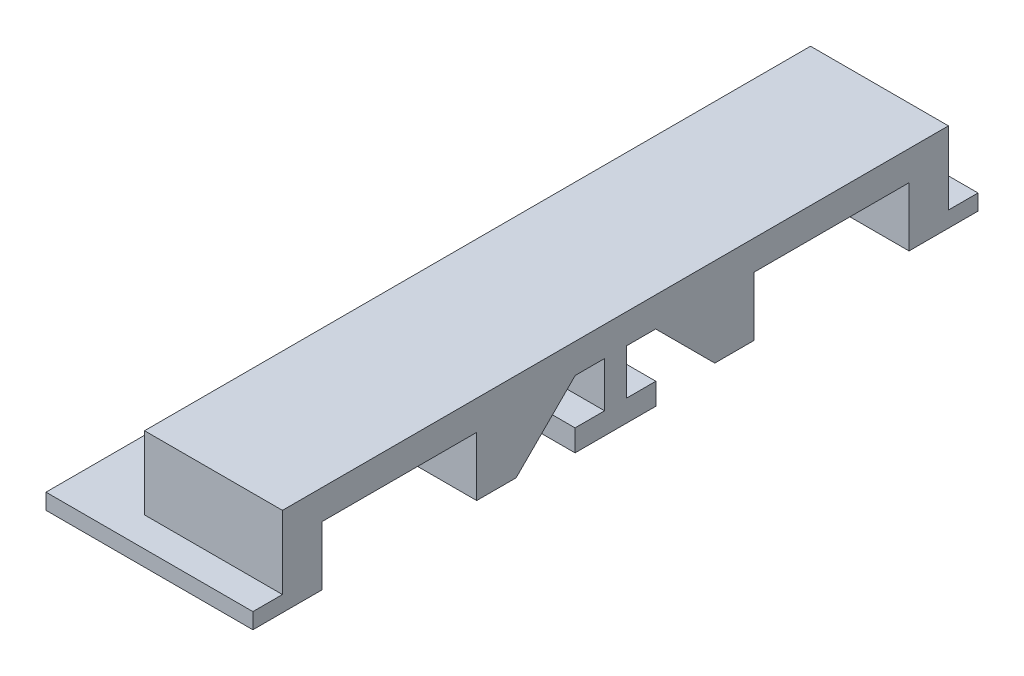
ISO-10303-21;
HEADER;
FILE_DESCRIPTION(('STEP AP214'),'2;1');
FILE_NAME('part.step','',(''),(''),'','','');
FILE_SCHEMA(('AUTOMOTIVE_DESIGN { 1 0 10303 214 1 1 1 1 }'));
ENDSEC;
DATA;
#1=APPLICATION_CONTEXT('core data for automotive mechanical design processes');
#2=APPLICATION_PROTOCOL_DEFINITION('international standard','automotive_design',2000,#1);
#3=PRODUCT_CONTEXT('',#1,'mechanical');
#4=PRODUCT('Part','Part','',(#3));
#5=PRODUCT_RELATED_PRODUCT_CATEGORY('part','',(#4));
#6=PRODUCT_DEFINITION_FORMATION('','',#4);
#7=PRODUCT_DEFINITION_CONTEXT('part definition',#1,'design');
#8=PRODUCT_DEFINITION('design','',#6,#7);
#9=PRODUCT_DEFINITION_SHAPE('','',#8);
#10=(LENGTH_UNIT() NAMED_UNIT(*) SI_UNIT(.MILLI.,.METRE.));
#11=(NAMED_UNIT(*) PLANE_ANGLE_UNIT() SI_UNIT($,.RADIAN.));
#12=(NAMED_UNIT(*) SI_UNIT($,.STERADIAN.) SOLID_ANGLE_UNIT());
#13=UNCERTAINTY_MEASURE_WITH_UNIT(LENGTH_MEASURE(1.E-05),#10,'distance_accuracy_value','');
#14=(GEOMETRIC_REPRESENTATION_CONTEXT(3) GLOBAL_UNCERTAINTY_ASSIGNED_CONTEXT((#13)) GLOBAL_UNIT_ASSIGNED_CONTEXT((#10,
#11,#12)) REPRESENTATION_CONTEXT('',''));
#15=CARTESIAN_POINT('',(0.,0.,0.));
#16=DIRECTION('',(0.,0.,1.));
#17=DIRECTION('',(1.,0.,0.));
#18=AXIS2_PLACEMENT_3D('',#15,#16,#17);
#19=CARTESIAN_POINT('',(0.,0.,0.));
#20=DIRECTION('',(1.,0.,0.));
#21=DIRECTION('',(0.,0.,-1.));
#22=AXIS2_PLACEMENT_3D('',#19,#20,#21);
#23=PLANE('',#22);
#24=DIRECTION('',(0.,0.,-1.));
#25=VECTOR('',#24,1.);
#26=CARTESIAN_POINT('',(0.,2.4,0.));
#27=LINE('',#26,#25);
#28=CARTESIAN_POINT('',(0.,2.4,16.9));
#29=VERTEX_POINT('',#28);
#30=CARTESIAN_POINT('',(0.,2.4,14.9));
#31=VERTEX_POINT('',#30);
#32=EDGE_CURVE('E305',#29,#31,#27,.T.);
#33=ORIENTED_EDGE('',*,*,#32,.F.);
#34=DIRECTION('',(0.,1.,0.));
#35=VECTOR('',#34,1.);
#36=CARTESIAN_POINT('',(0.,0.,16.9));
#37=LINE('',#36,#35);
#38=CARTESIAN_POINT('',(0.,6.1,16.9));
#39=VERTEX_POINT('',#38);
#40=EDGE_CURVE('E413',#29,#39,#37,.T.);
#41=ORIENTED_EDGE('',*,*,#40,.T.);
#42=DIRECTION('',(0.,0.,-1.));
#43=VECTOR('',#42,1.);
#44=CARTESIAN_POINT('',(0.,6.1,0.));
#45=LINE('',#44,#43);
#46=CARTESIAN_POINT('',(0.,6.1,-16.9));
#47=VERTEX_POINT('',#46);
#48=EDGE_CURVE('E338',#39,#47,#45,.T.);
#49=ORIENTED_EDGE('',*,*,#48,.T.);
#50=DIRECTION('',(0.,1.,0.));
#51=VECTOR('',#50,1.);
#52=CARTESIAN_POINT('',(0.,0.,-16.9));
#53=LINE('',#52,#51);
#54=CARTESIAN_POINT('',(0.,2.4,-16.9));
#55=VERTEX_POINT('',#54);
#56=EDGE_CURVE('E343',#55,#47,#53,.T.);
#57=ORIENTED_EDGE('',*,*,#56,.F.);
#58=DIRECTION('',(0.,0.,-1.));
#59=VECTOR('',#58,1.);
#60=CARTESIAN_POINT('',(0.,2.4,0.));
#61=LINE('',#60,#59);
#62=CARTESIAN_POINT('',(0.,2.4,-14.9));
#63=VERTEX_POINT('',#62);
#64=EDGE_CURVE('E41',#63,#55,#61,.T.);
#65=ORIENTED_EDGE('',*,*,#64,.F.);
#66=DIRECTION('',(0.,-1.,0.));
#67=VECTOR('',#66,1.);
#68=CARTESIAN_POINT('',(0.,0.,-14.9));
#69=LINE('',#68,#67);
#70=CARTESIAN_POINT('',(0.,4.6,-14.9));
#71=VERTEX_POINT('',#70);
#72=EDGE_CURVE('E456',#71,#63,#69,.T.);
#73=ORIENTED_EDGE('',*,*,#72,.F.);
#74=DIRECTION('',(0.,0.,1.));
#75=VECTOR('',#74,1.);
#76=CARTESIAN_POINT('',(0.,4.6,0.));
#77=LINE('',#76,#75);
#78=CARTESIAN_POINT('',(0.,4.6,-7.04142135623731));
#79=VERTEX_POINT('',#78);
#80=EDGE_CURVE('E453',#71,#79,#77,.T.);
#81=ORIENTED_EDGE('',*,*,#80,.T.);
#82=DIRECTION('',(0.,-1.,0.));
#83=VECTOR('',#82,1.);
#84=CARTESIAN_POINT('',(0.,0.,-7.04142135623731));
#85=LINE('',#84,#83);
#86=CARTESIAN_POINT('',(0.,2.4,-7.04142135623731));
#87=VERTEX_POINT('',#86);
#88=EDGE_CURVE('E450',#79,#87,#85,.T.);
#89=ORIENTED_EDGE('',*,*,#88,.T.);
#90=CARTESIAN_POINT('',(0.,2.4,-4.24142135623732));
#91=VERTEX_POINT('',#90);
#92=EDGE_CURVE('E11',#91,#87,#61,.T.);
#93=ORIENTED_EDGE('',*,*,#92,.F.);
#94=DIRECTION('',(0.,0.707106781186551,0.707106781186544));
#95=VECTOR('',#94,1.);
#96=CARTESIAN_POINT('',(0.,3.32071067811865,-3.32071067811868));
#97=LINE('',#96,#95);
#98=CARTESIAN_POINT('',(0.,4.6,-2.04142135623735));
#99=VERTEX_POINT('',#98);
#100=EDGE_CURVE('E448',#91,#99,#97,.T.);
#101=ORIENTED_EDGE('',*,*,#100,.T.);
#102=DIRECTION('',(0.,0.,1.));
#103=VECTOR('',#102,1.);
#104=CARTESIAN_POINT('',(0.,4.6,0.));
#105=LINE('',#104,#103);
#106=CARTESIAN_POINT('',(0.,4.6,-0.550000000000034));
#107=VERTEX_POINT('',#106);
#108=EDGE_CURVE('E445',#99,#107,#105,.T.);
#109=ORIENTED_EDGE('',*,*,#108,.T.);
#110=DIRECTION('',(0.,1.,0.));
#111=VECTOR('',#110,1.);
#112=CARTESIAN_POINT('',(0.,0.,-0.550000000000038));
#113=LINE('',#112,#111);
#114=CARTESIAN_POINT('',(0.,2.3,-0.550000000000036));
#115=VERTEX_POINT('',#114);
#116=EDGE_CURVE('E442',#115,#107,#113,.T.);
#117=ORIENTED_EDGE('',*,*,#116,.F.);
#118=DIRECTION('',(0.,0.,1.));
#119=VECTOR('',#118,1.);
#120=CARTESIAN_POINT('',(0.,2.3,0.));
#121=LINE('',#120,#119);
#122=CARTESIAN_POINT('',(0.,2.3,-2.05000000000004));
#123=VERTEX_POINT('',#122);
#124=EDGE_CURVE('E440',#123,#115,#121,.T.);
#125=ORIENTED_EDGE('',*,*,#124,.F.);
#126=DIRECTION('',(0.,1.,0.));
#127=VECTOR('',#126,1.);
#128=CARTESIAN_POINT('',(0.,0.,-2.05000000000004));
#129=LINE('',#128,#127);
#130=CARTESIAN_POINT('',(0.,1.2,-2.05000000000004));
#131=VERTEX_POINT('',#130);
#132=EDGE_CURVE('E438',#131,#123,#129,.T.);
#133=ORIENTED_EDGE('',*,*,#132,.F.);
#134=DIRECTION('',(0.,0.,-1.));
#135=VECTOR('',#134,1.);
#136=CARTESIAN_POINT('',(0.,1.2,0.));
#137=LINE('',#136,#135);
#138=CARTESIAN_POINT('',(0.,1.2,2.05000000000004));
#139=VERTEX_POINT('',#138);
#140=EDGE_CURVE('E436',#139,#131,#137,.T.);
#141=ORIENTED_EDGE('',*,*,#140,.F.);
#142=DIRECTION('',(0.,-1.,0.));
#143=VECTOR('',#142,1.);
#144=CARTESIAN_POINT('',(0.,0.,2.05000000000004));
#145=LINE('',#144,#143);
#146=CARTESIAN_POINT('',(0.,2.3,2.05000000000004));
#147=VERTEX_POINT('',#146);
#148=EDGE_CURVE('E434',#147,#139,#145,.T.);
#149=ORIENTED_EDGE('',*,*,#148,.F.);
#150=DIRECTION('',(0.,0.,1.));
#151=VECTOR('',#150,1.);
#152=CARTESIAN_POINT('',(0.,2.3,0.));
#153=LINE('',#152,#151);
#154=CARTESIAN_POINT('',(0.,2.3,0.550000000000036));
#155=VERTEX_POINT('',#154);
#156=EDGE_CURVE('E432',#155,#147,#153,.T.);
#157=ORIENTED_EDGE('',*,*,#156,.F.);
#158=DIRECTION('',(0.,1.,0.));
#159=VECTOR('',#158,1.);
#160=CARTESIAN_POINT('',(0.,0.,0.550000000000029));
#161=LINE('',#160,#159);
#162=CARTESIAN_POINT('',(0.,4.6,0.550000000000034));
#163=VERTEX_POINT('',#162);
#164=EDGE_CURVE('E429',#155,#163,#161,.T.);
#165=ORIENTED_EDGE('',*,*,#164,.T.);
#166=DIRECTION('',(0.,0.,1.));
#167=VECTOR('',#166,1.);
#168=CARTESIAN_POINT('',(0.,4.6,0.));
#169=LINE('',#168,#167);
#170=CARTESIAN_POINT('',(0.,4.6,2.04142135623734));
#171=VERTEX_POINT('',#170);
#172=EDGE_CURVE('E426',#163,#171,#169,.T.);
#173=ORIENTED_EDGE('',*,*,#172,.T.);
#174=DIRECTION('',(0.,-0.707106781186551,0.707106781186544));
#175=VECTOR('',#174,1.);
#176=CARTESIAN_POINT('',(0.,3.32071067811865,3.32071067811868));
#177=LINE('',#176,#175);
#178=CARTESIAN_POINT('',(0.,2.4,4.24142135623732));
#179=VERTEX_POINT('',#178);
#180=EDGE_CURVE('E423',#171,#179,#177,.T.);
#181=ORIENTED_EDGE('',*,*,#180,.T.);
#182=CARTESIAN_POINT('',(0.,2.4,7.04142135623731));
#183=VERTEX_POINT('',#182);
#184=EDGE_CURVE('E303',#183,#179,#27,.T.);
#185=ORIENTED_EDGE('',*,*,#184,.F.);
#186=DIRECTION('',(0.,-1.,0.));
#187=VECTOR('',#186,1.);
#188=CARTESIAN_POINT('',(0.,0.,7.04142135623731));
#189=LINE('',#188,#187);
#190=CARTESIAN_POINT('',(0.,4.6,7.04142135623731));
#191=VERTEX_POINT('',#190);
#192=EDGE_CURVE('E420',#191,#183,#189,.T.);
#193=ORIENTED_EDGE('',*,*,#192,.F.);
#194=DIRECTION('',(0.,0.,-1.));
#195=VECTOR('',#194,1.);
#196=CARTESIAN_POINT('',(0.,4.6,0.));
#197=LINE('',#196,#195);
#198=CARTESIAN_POINT('',(0.,4.6,14.9));
#199=VERTEX_POINT('',#198);
#200=EDGE_CURVE('E418',#199,#191,#197,.T.);
#201=ORIENTED_EDGE('',*,*,#200,.F.);
#202=DIRECTION('',(0.,-1.,0.));
#203=VECTOR('',#202,1.);
#204=CARTESIAN_POINT('',(0.,0.,14.9));
#205=LINE('',#204,#203);
#206=EDGE_CURVE('E416',#199,#31,#205,.T.);
#207=ORIENTED_EDGE('',*,*,#206,.T.);
#208=EDGE_LOOP('',(#33,#41,#49,#57,#65,#73,#81,#89,#93,#101,#109,#117,#125,#133,#141,#149,#157,
#165,#173,#181,#185,#193,#201,#207));
#209=FACE_BOUND('',#208,.T.);
#210=ADVANCED_FACE('F37',(#209),#23,.F.);
#211=CARTESIAN_POINT('',(7.,0.,14.9));
#212=DIRECTION('',(0.,0.,-1.));
#213=DIRECTION('',(-1.,0.,0.));
#214=AXIS2_PLACEMENT_3D('',#211,#212,#213);
#215=PLANE('',#214);
#216=DIRECTION('',(0.,-1.,0.));
#217=VECTOR('',#216,1.);
#218=CARTESIAN_POINT('',(3.5,0.,14.9));
#219=LINE('',#218,#217);
#220=CARTESIAN_POINT('',(3.5,2.4,14.9));
#221=VERTEX_POINT('',#220);
#222=CARTESIAN_POINT('',(3.5,1.6,14.9));
#223=VERTEX_POINT('',#222);
#224=EDGE_CURVE('E52',#221,#223,#219,.T.);
#225=ORIENTED_EDGE('',*,*,#224,.F.);
#226=DIRECTION('',(-1.,0.,0.));
#227=VECTOR('',#226,1.);
#228=CARTESIAN_POINT('',(7.,2.4,14.9));
#229=LINE('',#228,#227);
#230=EDGE_CURVE('E56',#221,#31,#229,.T.);
#231=ORIENTED_EDGE('',*,*,#230,.T.);
#232=ORIENTED_EDGE('',*,*,#206,.F.);
#233=DIRECTION('',(-1.,0.,0.));
#234=VECTOR('',#233,1.);
#235=CARTESIAN_POINT('',(7.,4.6,14.9));
#236=LINE('',#235,#234);
#237=CARTESIAN_POINT('',(7.,4.6,14.9));
#238=VERTEX_POINT('',#237);
#239=EDGE_CURVE('E509',#238,#199,#236,.T.);
#240=ORIENTED_EDGE('',*,*,#239,.F.);
#241=DIRECTION('',(0.,-1.,0.));
#242=VECTOR('',#241,1.);
#243=CARTESIAN_POINT('',(7.,0.,14.9));
#244=LINE('',#243,#242);
#245=CARTESIAN_POINT('',(7.,1.6,14.9));
#246=VERTEX_POINT('',#245);
#247=EDGE_CURVE('E354',#238,#246,#244,.T.);
#248=ORIENTED_EDGE('',*,*,#247,.T.);
#249=DIRECTION('',(-1.,0.,0.));
#250=VECTOR('',#249,1.);
#251=CARTESIAN_POINT('',(7.,1.6,14.9));
#252=LINE('',#251,#250);
#253=EDGE_CURVE('E511',#246,#223,#252,.T.);
#254=ORIENTED_EDGE('',*,*,#253,.T.);
#255=EDGE_LOOP('',(#225,#231,#232,#240,#248,#254));
#256=FACE_BOUND('',#255,.T.);
#257=ADVANCED_FACE('F603',(#256),#215,.T.);
#258=CARTESIAN_POINT('',(7.,0.,7.04142135623731));
#259=DIRECTION('',(0.,0.,-1.));
#260=DIRECTION('',(-1.,0.,0.));
#261=AXIS2_PLACEMENT_3D('',#258,#259,#260);
#262=PLANE('',#261);
#263=DIRECTION('',(-1.,0.,0.));
#264=VECTOR('',#263,1.);
#265=CARTESIAN_POINT('',(7.,2.4,7.04142135623731));
#266=LINE('',#265,#264);
#267=CARTESIAN_POINT('',(3.5,2.4,7.04142135623731));
#268=VERTEX_POINT('',#267);
#269=EDGE_CURVE('E301',#268,#183,#266,.T.);
#270=ORIENTED_EDGE('',*,*,#269,.F.);
#271=DIRECTION('',(0.,-1.,0.));
#272=VECTOR('',#271,1.);
#273=CARTESIAN_POINT('',(3.5,0.,7.04142135623731));
#274=LINE('',#273,#272);
#275=CARTESIAN_POINT('',(3.5,1.6,7.04142135623731));
#276=VERTEX_POINT('',#275);
#277=EDGE_CURVE('E297',#268,#276,#274,.T.);
#278=ORIENTED_EDGE('',*,*,#277,.T.);
#279=DIRECTION('',(-1.,0.,0.));
#280=VECTOR('',#279,1.);
#281=CARTESIAN_POINT('',(7.,1.6,7.04142135623731));
#282=LINE('',#281,#280);
#283=CARTESIAN_POINT('',(7.,1.6,7.04142135623731));
#284=VERTEX_POINT('',#283);
#285=EDGE_CURVE('E268',#284,#276,#282,.T.);
#286=ORIENTED_EDGE('',*,*,#285,.F.);
#287=DIRECTION('',(0.,-1.,0.));
#288=VECTOR('',#287,1.);
#289=CARTESIAN_POINT('',(7.,0.,7.04142135623731));
#290=LINE('',#289,#288);
#291=CARTESIAN_POINT('',(7.,4.6,7.04142135623731));
#292=VERTEX_POINT('',#291);
#293=EDGE_CURVE('E359',#292,#284,#290,.T.);
#294=ORIENTED_EDGE('',*,*,#293,.F.);
#295=DIRECTION('',(-1.,0.,0.));
#296=VECTOR('',#295,1.);
#297=CARTESIAN_POINT('',(7.,4.6,7.04142135623731));
#298=LINE('',#297,#296);
#299=EDGE_CURVE('E506',#292,#191,#298,.T.);
#300=ORIENTED_EDGE('',*,*,#299,.T.);
#301=ORIENTED_EDGE('',*,*,#192,.T.);
#302=EDGE_LOOP('',(#270,#278,#286,#294,#300,#301));
#303=FACE_BOUND('',#302,.T.);
#304=ADVANCED_FACE('F596',(#303),#262,.F.);
#305=CARTESIAN_POINT('',(7.,0.,-7.04142135623731));
#306=DIRECTION('',(0.,0.,-1.));
#307=DIRECTION('',(-1.,0.,0.));
#308=AXIS2_PLACEMENT_3D('',#305,#306,#307);
#309=PLANE('',#308);
#310=DIRECTION('',(0.,-1.,0.));
#311=VECTOR('',#310,1.);
#312=CARTESIAN_POINT('',(3.5,0.,-7.04142135623731));
#313=LINE('',#312,#311);
#314=CARTESIAN_POINT('',(3.5,2.4,-7.04142135623731));
#315=VERTEX_POINT('',#314);
#316=CARTESIAN_POINT('',(3.5,1.6,-7.04142135623731));
#317=VERTEX_POINT('',#316);
#318=EDGE_CURVE('E335',#315,#317,#313,.T.);
#319=ORIENTED_EDGE('',*,*,#318,.F.);
#320=DIRECTION('',(-1.,0.,0.));
#321=VECTOR('',#320,1.);
#322=CARTESIAN_POINT('',(7.,2.4,-7.04142135623731));
#323=LINE('',#322,#321);
#324=EDGE_CURVE('E331',#315,#87,#323,.T.);
#325=ORIENTED_EDGE('',*,*,#324,.T.);
#326=ORIENTED_EDGE('',*,*,#88,.F.);
#327=DIRECTION('',(-1.,0.,0.));
#328=VECTOR('',#327,1.);
#329=CARTESIAN_POINT('',(7.,4.6,-7.04142135623731));
#330=LINE('',#329,#328);
#331=CARTESIAN_POINT('',(7.,4.6,-7.04142135623731));
#332=VERTEX_POINT('',#331);
#333=EDGE_CURVE('E473',#332,#79,#330,.T.);
#334=ORIENTED_EDGE('',*,*,#333,.F.);
#335=DIRECTION('',(0.,-1.,0.));
#336=VECTOR('',#335,1.);
#337=CARTESIAN_POINT('',(7.,0.,-7.04142135623731));
#338=LINE('',#337,#336);
#339=CARTESIAN_POINT('',(7.,1.6,-7.04142135623731));
#340=VERTEX_POINT('',#339);
#341=EDGE_CURVE('E391',#332,#340,#338,.T.);
#342=ORIENTED_EDGE('',*,*,#341,.T.);
#343=DIRECTION('',(-1.,0.,0.));
#344=VECTOR('',#343,1.);
#345=CARTESIAN_POINT('',(7.,1.6,-7.04142135623731));
#346=LINE('',#345,#344);
#347=EDGE_CURVE('E475',#340,#317,#346,.T.);
#348=ORIENTED_EDGE('',*,*,#347,.T.);
#349=EDGE_LOOP('',(#319,#325,#326,#334,#342,#348));
#350=FACE_BOUND('',#349,.T.);
#351=ADVANCED_FACE('F651',(#350),#309,.T.);
#352=CARTESIAN_POINT('',(7.,0.,-14.9));
#353=DIRECTION('',(0.,0.,-1.));
#354=DIRECTION('',(-1.,0.,0.));
#355=AXIS2_PLACEMENT_3D('',#352,#353,#354);
#356=PLANE('',#355);
#357=DIRECTION('',(-1.,0.,0.));
#358=VECTOR('',#357,1.);
#359=CARTESIAN_POINT('',(7.,2.40000000000001,-14.9));
#360=LINE('',#359,#358);
#361=CARTESIAN_POINT('',(3.5,2.4,-14.9));
#362=VERTEX_POINT('',#361);
#363=EDGE_CURVE('E328',#362,#63,#360,.T.);
#364=ORIENTED_EDGE('',*,*,#363,.F.);
#365=DIRECTION('',(0.,-1.,0.));
#366=VECTOR('',#365,1.);
#367=CARTESIAN_POINT('',(3.5,0.,-14.9));
#368=LINE('',#367,#366);
#369=CARTESIAN_POINT('',(3.5,1.6,-14.9));
#370=VERTEX_POINT('',#369);
#371=EDGE_CURVE('E333',#362,#370,#368,.T.);
#372=ORIENTED_EDGE('',*,*,#371,.T.);
#373=DIRECTION('',(-1.,0.,0.));
#374=VECTOR('',#373,1.);
#375=CARTESIAN_POINT('',(7.,1.6,-14.9));
#376=LINE('',#375,#374);
#377=CARTESIAN_POINT('',(7.,1.6,-14.9));
#378=VERTEX_POINT('',#377);
#379=EDGE_CURVE('E468',#378,#370,#376,.T.);
#380=ORIENTED_EDGE('',*,*,#379,.F.);
#381=DIRECTION('',(0.,-1.,0.));
#382=VECTOR('',#381,1.);
#383=CARTESIAN_POINT('',(7.,0.,-14.9));
#384=LINE('',#383,#382);
#385=CARTESIAN_POINT('',(7.,4.6,-14.9));
#386=VERTEX_POINT('',#385);
#387=EDGE_CURVE('E397',#386,#378,#384,.T.);
#388=ORIENTED_EDGE('',*,*,#387,.F.);
#389=DIRECTION('',(-1.,0.,0.));
#390=VECTOR('',#389,1.);
#391=CARTESIAN_POINT('',(7.,4.6,-14.9));
#392=LINE('',#391,#390);
#393=EDGE_CURVE('E471',#386,#71,#392,.T.);
#394=ORIENTED_EDGE('',*,*,#393,.T.);
#395=ORIENTED_EDGE('',*,*,#72,.T.);
#396=EDGE_LOOP('',(#364,#372,#380,#388,#394,#395));
#397=FACE_BOUND('',#396,.T.);
#398=ADVANCED_FACE('F531',(#397),#356,.F.);
#399=CARTESIAN_POINT('',(7.,6.1,0.));
#400=DIRECTION('',(0.,1.,0.));
#401=DIRECTION('',(0.,0.,1.));
#402=AXIS2_PLACEMENT_3D('',#399,#400,#401);
#403=PLANE('',#402);
#404=ORIENTED_EDGE('',*,*,#48,.F.);
#405=DIRECTION('',(-1.,0.,0.));
#406=VECTOR('',#405,1.);
#407=CARTESIAN_POINT('',(7.,6.1,16.9));
#408=LINE('',#407,#406);
#409=CARTESIAN_POINT('',(7.,6.1,16.9));
#410=VERTEX_POINT('',#409);
#411=EDGE_CURVE('E517',#410,#39,#408,.T.);
#412=ORIENTED_EDGE('',*,*,#411,.F.);
#413=DIRECTION('',(0.,0.,-1.));
#414=VECTOR('',#413,1.);
#415=CARTESIAN_POINT('',(7.,6.1,0.));
#416=LINE('',#415,#414);
#417=CARTESIAN_POINT('',(7.,6.1,-16.9));
#418=VERTEX_POINT('',#417);
#419=EDGE_CURVE('E339',#410,#418,#416,.T.);
#420=ORIENTED_EDGE('',*,*,#419,.T.);
#421=DIRECTION('',(-1.,0.,0.));
#422=VECTOR('',#421,1.);
#423=CARTESIAN_POINT('',(7.,6.1,-16.9));
#424=LINE('',#423,#422);
#425=EDGE_CURVE('E410',#418,#47,#424,.T.);
#426=ORIENTED_EDGE('',*,*,#425,.T.);
#427=EDGE_LOOP('',(#404,#412,#420,#426));
#428=FACE_BOUND('',#427,.T.);
#429=ADVANCED_FACE('F39',(#428),#403,.T.);
#430=CARTESIAN_POINT('',(7.,0.,16.9));
#431=DIRECTION('',(0.,0.,1.));
#432=DIRECTION('',(1.,0.,0.));
#433=AXIS2_PLACEMENT_3D('',#430,#431,#432);
#434=PLANE('',#433);
#435=ORIENTED_EDGE('',*,*,#40,.F.);
#436=DIRECTION('',(-1.,0.,0.));
#437=VECTOR('',#436,1.);
#438=CARTESIAN_POINT('',(7.,2.4,16.9));
#439=LINE('',#438,#437);
#440=CARTESIAN_POINT('',(7.,2.4,16.9));
#441=VERTEX_POINT('',#440);
#442=EDGE_CURVE('E516',#441,#29,#439,.T.);
#443=ORIENTED_EDGE('',*,*,#442,.F.);
#444=DIRECTION('',(0.,1.,0.));
#445=VECTOR('',#444,1.);
#446=CARTESIAN_POINT('',(7.,0.,16.9));
#447=LINE('',#446,#445);
#448=EDGE_CURVE('E342',#441,#410,#447,.T.);
#449=ORIENTED_EDGE('',*,*,#448,.T.);
#450=ORIENTED_EDGE('',*,*,#411,.T.);
#451=EDGE_LOOP('',(#435,#443,#449,#450));
#452=FACE_BOUND('',#451,.T.);
#453=ADVANCED_FACE('F690',(#452),#434,.T.);
#454=CARTESIAN_POINT('',(7.,2.4,0.));
#455=DIRECTION('',(0.,1.,0.));
#456=DIRECTION('',(0.,0.,1.));
#457=AXIS2_PLACEMENT_3D('',#454,#455,#456);
#458=PLANE('',#457);
#459=ORIENTED_EDGE('',*,*,#442,.T.);
#460=ORIENTED_EDGE('',*,*,#32,.T.);
#461=ORIENTED_EDGE('',*,*,#230,.F.);
#462=DIRECTION('',(0.,0.,-1.));
#463=VECTOR('',#462,1.);
#464=CARTESIAN_POINT('',(3.5,2.4,0.));
#465=LINE('',#464,#463);
#466=EDGE_CURVE('E284',#221,#268,#465,.T.);
#467=ORIENTED_EDGE('',*,*,#466,.T.);
#468=ORIENTED_EDGE('',*,*,#269,.T.);
#469=ORIENTED_EDGE('',*,*,#184,.T.);
#470=DIRECTION('',(1.,0.,0.));
#471=VECTOR('',#470,1.);
#472=CARTESIAN_POINT('',(-3.5,2.4,4.24142135623732));
#473=LINE('',#472,#471);
#474=CARTESIAN_POINT('',(-3.5,2.4,4.24142135623732));
#475=VERTEX_POINT('',#474);
#476=EDGE_CURVE('E293',#475,#179,#473,.T.);
#477=ORIENTED_EDGE('',*,*,#476,.F.);
#478=DIRECTION('',(0.,0.,-1.));
#479=VECTOR('',#478,1.);
#480=CARTESIAN_POINT('',(-3.5,2.4,0.));
#481=LINE('',#480,#479);
#482=CARTESIAN_POINT('',(-3.5,2.4,18.4));
#483=VERTEX_POINT('',#482);
#484=EDGE_CURVE('E277',#483,#475,#481,.T.);
#485=ORIENTED_EDGE('',*,*,#484,.F.);
#486=DIRECTION('',(-1.,0.,0.));
#487=VECTOR('',#486,1.);
#488=CARTESIAN_POINT('',(7.,2.4,18.4));
#489=LINE('',#488,#487);
#490=CARTESIAN_POINT('',(7.,2.4,18.4));
#491=VERTEX_POINT('',#490);
#492=EDGE_CURVE('E514',#491,#483,#489,.T.);
#493=ORIENTED_EDGE('',*,*,#492,.F.);
#494=DIRECTION('',(0.,0.,-1.));
#495=VECTOR('',#494,1.);
#496=CARTESIAN_POINT('',(7.,2.4,0.));
#497=LINE('',#496,#495);
#498=EDGE_CURVE('E346',#491,#441,#497,.T.);
#499=ORIENTED_EDGE('',*,*,#498,.T.);
#500=EDGE_LOOP('',(#459,#460,#461,#467,#468,#469,#477,#485,#493,#499));
#501=FACE_BOUND('',#500,.T.);
#502=ADVANCED_FACE('F592',(#501),#458,.T.);
#503=CARTESIAN_POINT('',(7.,0.,18.4));
#504=DIRECTION('',(0.,0.,1.));
#505=DIRECTION('',(1.,0.,0.));
#506=AXIS2_PLACEMENT_3D('',#503,#504,#505);
#507=PLANE('',#506);
#508=ORIENTED_EDGE('',*,*,#492,.T.);
#509=DIRECTION('',(0.,1.,0.));
#510=VECTOR('',#509,1.);
#511=CARTESIAN_POINT('',(-3.5,0.,18.4));
#512=LINE('',#511,#510);
#513=CARTESIAN_POINT('',(-3.5,1.6,18.4));
#514=VERTEX_POINT('',#513);
#515=EDGE_CURVE('E291',#514,#483,#512,.T.);
#516=ORIENTED_EDGE('',*,*,#515,.F.);
#517=DIRECTION('',(-1.,0.,0.));
#518=VECTOR('',#517,1.);
#519=CARTESIAN_POINT('',(7.,1.6,18.4));
#520=LINE('',#519,#518);
#521=CARTESIAN_POINT('',(7.,1.6,18.4));
#522=VERTEX_POINT('',#521);
#523=EDGE_CURVE('E282',#522,#514,#520,.T.);
#524=ORIENTED_EDGE('',*,*,#523,.F.);
#525=DIRECTION('',(0.,1.,0.));
#526=VECTOR('',#525,1.);
#527=CARTESIAN_POINT('',(7.,0.,18.4));
#528=LINE('',#527,#526);
#529=EDGE_CURVE('E349',#522,#491,#528,.T.);
#530=ORIENTED_EDGE('',*,*,#529,.T.);
#531=EDGE_LOOP('',(#508,#516,#524,#530));
#532=FACE_BOUND('',#531,.T.);
#533=ADVANCED_FACE('F684',(#532),#507,.T.);
#534=CARTESIAN_POINT('',(7.,4.6,0.));
#535=DIRECTION('',(0.,1.,0.));
#536=DIRECTION('',(0.,0.,1.));
#537=AXIS2_PLACEMENT_3D('',#534,#535,#536);
#538=PLANE('',#537);
#539=ORIENTED_EDGE('',*,*,#200,.T.);
#540=ORIENTED_EDGE('',*,*,#299,.F.);
#541=DIRECTION('',(0.,0.,-1.));
#542=VECTOR('',#541,1.);
#543=CARTESIAN_POINT('',(7.,4.6,0.));
#544=LINE('',#543,#542);
#545=EDGE_CURVE('E357',#238,#292,#544,.T.);
#546=ORIENTED_EDGE('',*,*,#545,.F.);
#547=ORIENTED_EDGE('',*,*,#239,.T.);
#548=EDGE_LOOP('',(#539,#540,#546,#547));
#549=FACE_BOUND('',#548,.T.);
#550=ADVANCED_FACE('F606',(#549),#538,.F.);
#551=CARTESIAN_POINT('',(7.,1.6,0.));
#552=DIRECTION('',(0.,-1.,0.));
#553=DIRECTION('',(0.,0.,-1.));
#554=AXIS2_PLACEMENT_3D('',#551,#552,#553);
#555=PLANE('',#554);
#556=ORIENTED_EDGE('',*,*,#523,.T.);
#557=DIRECTION('',(0.,0.,1.));
#558=VECTOR('',#557,1.);
#559=CARTESIAN_POINT('',(-3.5,1.6,0.));
#560=LINE('',#559,#558);
#561=CARTESIAN_POINT('',(-3.5,1.6,5.04142135623731));
#562=VERTEX_POINT('',#561);
#563=EDGE_CURVE('E275',#562,#514,#560,.T.);
#564=ORIENTED_EDGE('',*,*,#563,.F.);
#565=DIRECTION('',(-1.,0.,0.));
#566=VECTOR('',#565,1.);
#567=CARTESIAN_POINT('',(7.,1.6,5.04142135623731));
#568=LINE('',#567,#566);
#569=CARTESIAN_POINT('',(7.,1.6,5.04142135623731));
#570=VERTEX_POINT('',#569);
#571=EDGE_CURVE('E257',#570,#562,#568,.T.);
#572=ORIENTED_EDGE('',*,*,#571,.F.);
#573=DIRECTION('',(0.,0.,1.));
#574=VECTOR('',#573,1.);
#575=CARTESIAN_POINT('',(7.,1.6,0.));
#576=LINE('',#575,#574);
#577=EDGE_CURVE('E361',#570,#284,#576,.T.);
#578=ORIENTED_EDGE('',*,*,#577,.T.);
#579=ORIENTED_EDGE('',*,*,#285,.T.);
#580=DIRECTION('',(0.,0.,1.));
#581=VECTOR('',#580,1.);
#582=CARTESIAN_POINT('',(3.5,1.6,0.));
#583=LINE('',#582,#581);
#584=EDGE_CURVE('E287',#276,#223,#583,.T.);
#585=ORIENTED_EDGE('',*,*,#584,.T.);
#586=ORIENTED_EDGE('',*,*,#253,.F.);
#587=DIRECTION('',(0.,0.,1.));
#588=VECTOR('',#587,1.);
#589=CARTESIAN_POINT('',(7.,1.6,0.));
#590=LINE('',#589,#588);
#591=EDGE_CURVE('E352',#246,#522,#590,.T.);
#592=ORIENTED_EDGE('',*,*,#591,.T.);
#593=EDGE_LOOP('',(#556,#564,#572,#578,#579,#585,#586,#592));
#594=FACE_BOUND('',#593,.T.);
#595=ADVANCED_FACE('F280',(#594),#555,.T.);
#596=CARTESIAN_POINT('',(7.,3.32071067811865,3.32071067811868));
#597=DIRECTION('',(0.,-0.707106781186544,-0.707106781186551));
#598=DIRECTION('',(0.,0.707106781186551,-0.707106781186544));
#599=AXIS2_PLACEMENT_3D('',#596,#597,#598);
#600=PLANE('',#599);
#601=ORIENTED_EDGE('',*,*,#571,.T.);
#602=DIRECTION('',(0.,-0.707106781186551,0.707106781186544));
#603=VECTOR('',#602,1.);
#604=CARTESIAN_POINT('',(-3.5,3.32071067811865,3.32071067811868));
#605=LINE('',#604,#603);
#606=EDGE_CURVE('E261',#475,#562,#605,.T.);
#607=ORIENTED_EDGE('',*,*,#606,.F.);
#608=ORIENTED_EDGE('',*,*,#476,.T.);
#609=ORIENTED_EDGE('',*,*,#180,.F.);
#610=DIRECTION('',(-1.,0.,0.));
#611=VECTOR('',#610,1.);
#612=CARTESIAN_POINT('',(7.,4.6,2.04142135623734));
#613=LINE('',#612,#611);
#614=CARTESIAN_POINT('',(7.,4.6,2.04142135623734));
#615=VERTEX_POINT('',#614);
#616=EDGE_CURVE('E269',#615,#171,#613,.T.);
#617=ORIENTED_EDGE('',*,*,#616,.F.);
#618=DIRECTION('',(0.,-0.707106781186551,0.707106781186544));
#619=VECTOR('',#618,1.);
#620=CARTESIAN_POINT('',(7.,3.32071067811865,3.32071067811868));
#621=LINE('',#620,#619);
#622=EDGE_CURVE('E263',#615,#570,#621,.T.);
#623=ORIENTED_EDGE('',*,*,#622,.T.);
#624=EDGE_LOOP('',(#601,#607,#608,#609,#617,#623));
#625=FACE_BOUND('',#624,.T.);
#626=ADVANCED_FACE('F259',(#625),#600,.T.);
#627=CARTESIAN_POINT('',(7.,4.6,0.));
#628=DIRECTION('',(0.,-1.,0.));
#629=DIRECTION('',(0.,0.,-1.));
#630=AXIS2_PLACEMENT_3D('',#627,#628,#629);
#631=PLANE('',#630);
#632=ORIENTED_EDGE('',*,*,#172,.F.);
#633=DIRECTION('',(-1.,0.,0.));
#634=VECTOR('',#633,1.);
#635=CARTESIAN_POINT('',(7.,4.6,0.550000000000034));
#636=LINE('',#635,#634);
#637=CARTESIAN_POINT('',(7.,4.6,0.550000000000034));
#638=VERTEX_POINT('',#637);
#639=EDGE_CURVE('E501',#638,#163,#636,.T.);
#640=ORIENTED_EDGE('',*,*,#639,.F.);
#641=DIRECTION('',(0.,0.,1.));
#642=VECTOR('',#641,1.);
#643=CARTESIAN_POINT('',(7.,4.6,0.));
#644=LINE('',#643,#642);
#645=EDGE_CURVE('E364',#638,#615,#644,.T.);
#646=ORIENTED_EDGE('',*,*,#645,.T.);
#647=ORIENTED_EDGE('',*,*,#616,.T.);
#648=EDGE_LOOP('',(#632,#640,#646,#647));
#649=FACE_BOUND('',#648,.T.);
#650=ADVANCED_FACE('F587',(#649),#631,.T.);
#651=CARTESIAN_POINT('',(7.,0.,0.550000000000029));
#652=DIRECTION('',(0.,0.,1.));
#653=DIRECTION('',(0.,-1.,0.));
#654=AXIS2_PLACEMENT_3D('',#651,#652,#653);
#655=PLANE('',#654);
#656=ORIENTED_EDGE('',*,*,#164,.F.);
#657=DIRECTION('',(-1.,0.,0.));
#658=VECTOR('',#657,1.);
#659=CARTESIAN_POINT('',(7.,2.3,0.550000000000036));
#660=LINE('',#659,#658);
#661=CARTESIAN_POINT('',(7.,2.3,0.550000000000036));
#662=VERTEX_POINT('',#661);
#663=EDGE_CURVE('E499',#662,#155,#660,.T.);
#664=ORIENTED_EDGE('',*,*,#663,.F.);
#665=DIRECTION('',(0.,1.,0.));
#666=VECTOR('',#665,1.);
#667=CARTESIAN_POINT('',(7.,0.,0.550000000000029));
#668=LINE('',#667,#666);
#669=EDGE_CURVE('E367',#662,#638,#668,.T.);
#670=ORIENTED_EDGE('',*,*,#669,.T.);
#671=ORIENTED_EDGE('',*,*,#639,.T.);
#672=EDGE_LOOP('',(#656,#664,#670,#671));
#673=FACE_BOUND('',#672,.T.);
#674=ADVANCED_FACE('F581',(#673),#655,.T.);
#675=CARTESIAN_POINT('',(7.,2.3,0.));
#676=DIRECTION('',(0.,-1.,0.));
#677=DIRECTION('',(0.,0.,-1.));
#678=AXIS2_PLACEMENT_3D('',#675,#676,#677);
#679=PLANE('',#678);
#680=ORIENTED_EDGE('',*,*,#156,.T.);
#681=DIRECTION('',(-1.,0.,0.));
#682=VECTOR('',#681,1.);
#683=CARTESIAN_POINT('',(7.,2.3,2.05000000000004));
#684=LINE('',#683,#682);
#685=CARTESIAN_POINT('',(7.,2.3,2.05000000000004));
#686=VERTEX_POINT('',#685);
#687=EDGE_CURVE('E496',#686,#147,#684,.T.);
#688=ORIENTED_EDGE('',*,*,#687,.F.);
#689=DIRECTION('',(0.,0.,1.));
#690=VECTOR('',#689,1.);
#691=CARTESIAN_POINT('',(7.,2.3,0.));
#692=LINE('',#691,#690);
#693=EDGE_CURVE('E370',#662,#686,#692,.T.);
#694=ORIENTED_EDGE('',*,*,#693,.F.);
#695=ORIENTED_EDGE('',*,*,#663,.T.);
#696=EDGE_LOOP('',(#680,#688,#694,#695));
#697=FACE_BOUND('',#696,.T.);
#698=ADVANCED_FACE('F670',(#697),#679,.F.);
#699=CARTESIAN_POINT('',(7.,0.,2.05000000000004));
#700=DIRECTION('',(0.,0.,-1.));
#701=DIRECTION('',(0.,1.,0.));
#702=AXIS2_PLACEMENT_3D('',#699,#700,#701);
#703=PLANE('',#702);
#704=ORIENTED_EDGE('',*,*,#148,.T.);
#705=DIRECTION('',(-1.,0.,0.));
#706=VECTOR('',#705,1.);
#707=CARTESIAN_POINT('',(7.,1.2,2.05000000000004));
#708=LINE('',#707,#706);
#709=CARTESIAN_POINT('',(7.,1.2,2.05000000000004));
#710=VERTEX_POINT('',#709);
#711=EDGE_CURVE('E493',#710,#139,#708,.T.);
#712=ORIENTED_EDGE('',*,*,#711,.F.);
#713=DIRECTION('',(0.,-1.,0.));
#714=VECTOR('',#713,1.);
#715=CARTESIAN_POINT('',(7.,0.,2.05000000000004));
#716=LINE('',#715,#714);
#717=EDGE_CURVE('E372',#686,#710,#716,.T.);
#718=ORIENTED_EDGE('',*,*,#717,.F.);
#719=ORIENTED_EDGE('',*,*,#687,.T.);
#720=EDGE_LOOP('',(#704,#712,#718,#719));
#721=FACE_BOUND('',#720,.T.);
#722=ADVANCED_FACE('F575',(#721),#703,.F.);
#723=CARTESIAN_POINT('',(7.,1.2,0.));
#724=DIRECTION('',(0.,1.,0.));
#725=DIRECTION('',(0.,0.,1.));
#726=AXIS2_PLACEMENT_3D('',#723,#724,#725);
#727=PLANE('',#726);
#728=ORIENTED_EDGE('',*,*,#140,.T.);
#729=DIRECTION('',(-1.,0.,0.));
#730=VECTOR('',#729,1.);
#731=CARTESIAN_POINT('',(7.,1.2,-2.05000000000004));
#732=LINE('',#731,#730);
#733=CARTESIAN_POINT('',(7.,1.2,-2.05000000000004));
#734=VERTEX_POINT('',#733);
#735=EDGE_CURVE('E490',#734,#131,#732,.T.);
#736=ORIENTED_EDGE('',*,*,#735,.F.);
#737=DIRECTION('',(0.,0.,-1.));
#738=VECTOR('',#737,1.);
#739=CARTESIAN_POINT('',(7.,1.2,0.));
#740=LINE('',#739,#738);
#741=EDGE_CURVE('E374',#710,#734,#740,.T.);
#742=ORIENTED_EDGE('',*,*,#741,.F.);
#743=ORIENTED_EDGE('',*,*,#711,.T.);
#744=EDGE_LOOP('',(#728,#736,#742,#743));
#745=FACE_BOUND('',#744,.T.);
#746=ADVANCED_FACE('F571',(#745),#727,.F.);
#747=CARTESIAN_POINT('',(7.,0.,-2.05000000000004));
#748=DIRECTION('',(0.,0.,1.));
#749=DIRECTION('',(0.,-1.,0.));
#750=AXIS2_PLACEMENT_3D('',#747,#748,#749);
#751=PLANE('',#750);
#752=ORIENTED_EDGE('',*,*,#132,.T.);
#753=DIRECTION('',(-1.,0.,0.));
#754=VECTOR('',#753,1.);
#755=CARTESIAN_POINT('',(7.,2.3,-2.05000000000004));
#756=LINE('',#755,#754);
#757=CARTESIAN_POINT('',(7.,2.3,-2.05000000000004));
#758=VERTEX_POINT('',#757);
#759=EDGE_CURVE('E487',#758,#123,#756,.T.);
#760=ORIENTED_EDGE('',*,*,#759,.F.);
#761=DIRECTION('',(0.,1.,0.));
#762=VECTOR('',#761,1.);
#763=CARTESIAN_POINT('',(7.,0.,-2.05000000000004));
#764=LINE('',#763,#762);
#765=EDGE_CURVE('E376',#734,#758,#764,.T.);
#766=ORIENTED_EDGE('',*,*,#765,.F.);
#767=ORIENTED_EDGE('',*,*,#735,.T.);
#768=EDGE_LOOP('',(#752,#760,#766,#767));
#769=FACE_BOUND('',#768,.T.);
#770=ADVANCED_FACE('F566',(#769),#751,.F.);
#771=CARTESIAN_POINT('',(7.,2.3,0.));
#772=DIRECTION('',(0.,-1.,0.));
#773=DIRECTION('',(0.,0.,-1.));
#774=AXIS2_PLACEMENT_3D('',#771,#772,#773);
#775=PLANE('',#774);
#776=ORIENTED_EDGE('',*,*,#124,.T.);
#777=DIRECTION('',(-1.,0.,0.));
#778=VECTOR('',#777,1.);
#779=CARTESIAN_POINT('',(7.,2.3,-0.550000000000036));
#780=LINE('',#779,#778);
#781=CARTESIAN_POINT('',(7.,2.3,-0.550000000000036));
#782=VERTEX_POINT('',#781);
#783=EDGE_CURVE('E484',#782,#115,#780,.T.);
#784=ORIENTED_EDGE('',*,*,#783,.F.);
#785=DIRECTION('',(0.,0.,1.));
#786=VECTOR('',#785,1.);
#787=CARTESIAN_POINT('',(7.,2.3,0.));
#788=LINE('',#787,#786);
#789=EDGE_CURVE('E378',#758,#782,#788,.T.);
#790=ORIENTED_EDGE('',*,*,#789,.F.);
#791=ORIENTED_EDGE('',*,*,#759,.T.);
#792=EDGE_LOOP('',(#776,#784,#790,#791));
#793=FACE_BOUND('',#792,.T.);
#794=ADVANCED_FACE('F560',(#793),#775,.F.);
#795=CARTESIAN_POINT('',(7.,0.,-0.550000000000038));
#796=DIRECTION('',(0.,0.,1.));
#797=DIRECTION('',(0.,-1.,0.));
#798=AXIS2_PLACEMENT_3D('',#795,#796,#797);
#799=PLANE('',#798);
#800=ORIENTED_EDGE('',*,*,#116,.T.);
#801=DIRECTION('',(-1.,0.,0.));
#802=VECTOR('',#801,1.);
#803=CARTESIAN_POINT('',(7.,4.6,-0.550000000000034));
#804=LINE('',#803,#802);
#805=CARTESIAN_POINT('',(7.,4.6,-0.550000000000034));
#806=VERTEX_POINT('',#805);
#807=EDGE_CURVE('E482',#806,#107,#804,.T.);
#808=ORIENTED_EDGE('',*,*,#807,.F.);
#809=DIRECTION('',(0.,1.,0.));
#810=VECTOR('',#809,1.);
#811=CARTESIAN_POINT('',(7.,0.,-0.550000000000038));
#812=LINE('',#811,#810);
#813=EDGE_CURVE('E380',#782,#806,#812,.T.);
#814=ORIENTED_EDGE('',*,*,#813,.F.);
#815=ORIENTED_EDGE('',*,*,#783,.T.);
#816=EDGE_LOOP('',(#800,#808,#814,#815));
#817=FACE_BOUND('',#816,.T.);
#818=ADVANCED_FACE('F556',(#817),#799,.F.);
#819=CARTESIAN_POINT('',(7.,4.6,0.));
#820=DIRECTION('',(0.,-1.,0.));
#821=DIRECTION('',(0.,0.,-1.));
#822=AXIS2_PLACEMENT_3D('',#819,#820,#821);
#823=PLANE('',#822);
#824=ORIENTED_EDGE('',*,*,#108,.F.);
#825=DIRECTION('',(-1.,0.,0.));
#826=VECTOR('',#825,1.);
#827=CARTESIAN_POINT('',(7.,4.6,-2.04142135623735));
#828=LINE('',#827,#826);
#829=CARTESIAN_POINT('',(7.,4.6,-2.04142135623735));
#830=VERTEX_POINT('',#829);
#831=EDGE_CURVE('E479',#830,#99,#828,.T.);
#832=ORIENTED_EDGE('',*,*,#831,.F.);
#833=DIRECTION('',(0.,0.,1.));
#834=VECTOR('',#833,1.);
#835=CARTESIAN_POINT('',(7.,4.6,0.));
#836=LINE('',#835,#834);
#837=EDGE_CURVE('E382',#830,#806,#836,.T.);
#838=ORIENTED_EDGE('',*,*,#837,.T.);
#839=ORIENTED_EDGE('',*,*,#807,.T.);
#840=EDGE_LOOP('',(#824,#832,#838,#839));
#841=FACE_BOUND('',#840,.T.);
#842=ADVANCED_FACE('F551',(#841),#823,.T.);
#843=CARTESIAN_POINT('',(7.,3.32071067811865,-3.32071067811868));
#844=DIRECTION('',(0.,-0.707106781186544,0.707106781186551));
#845=DIRECTION('',(0.,-0.707106781186551,-0.707106781186544));
#846=AXIS2_PLACEMENT_3D('',#843,#844,#845);
#847=PLANE('',#846);
#848=ORIENTED_EDGE('',*,*,#100,.F.);
#849=DIRECTION('',(1.,0.,0.));
#850=VECTOR('',#849,1.);
#851=CARTESIAN_POINT('',(-3.5,2.4,-4.24142135623732));
#852=LINE('',#851,#850);
#853=CARTESIAN_POINT('',(-3.5,2.4,-4.24142135623732));
#854=VERTEX_POINT('',#853);
#855=EDGE_CURVE('E320',#854,#91,#852,.T.);
#856=ORIENTED_EDGE('',*,*,#855,.F.);
#857=DIRECTION('',(0.,0.707106781186551,0.707106781186544));
#858=VECTOR('',#857,1.);
#859=CARTESIAN_POINT('',(-3.5,3.32071067811865,-3.32071067811868));
#860=LINE('',#859,#858);
#861=CARTESIAN_POINT('',(-3.5,1.6,-5.04142135623731));
#862=VERTEX_POINT('',#861);
#863=EDGE_CURVE('E307',#862,#854,#860,.T.);
#864=ORIENTED_EDGE('',*,*,#863,.F.);
#865=DIRECTION('',(-1.,0.,0.));
#866=VECTOR('',#865,1.);
#867=CARTESIAN_POINT('',(7.,1.6,-5.04142135623731));
#868=LINE('',#867,#866);
#869=CARTESIAN_POINT('',(7.,1.6,-5.04142135623731));
#870=VERTEX_POINT('',#869);
#871=EDGE_CURVE('E477',#870,#862,#868,.T.);
#872=ORIENTED_EDGE('',*,*,#871,.F.);
#873=DIRECTION('',(0.,0.707106781186551,0.707106781186544));
#874=VECTOR('',#873,1.);
#875=CARTESIAN_POINT('',(7.,3.32071067811865,-3.32071067811868));
#876=LINE('',#875,#874);
#877=EDGE_CURVE('E385',#870,#830,#876,.T.);
#878=ORIENTED_EDGE('',*,*,#877,.T.);
#879=ORIENTED_EDGE('',*,*,#831,.T.);
#880=EDGE_LOOP('',(#848,#856,#864,#872,#878,#879));
#881=FACE_BOUND('',#880,.T.);
#882=ADVANCED_FACE('F546',(#881),#847,.T.);
#883=CARTESIAN_POINT('',(7.,4.6,0.));
#884=DIRECTION('',(0.,-1.,0.));
#885=DIRECTION('',(0.,0.,-1.));
#886=AXIS2_PLACEMENT_3D('',#883,#884,#885);
#887=PLANE('',#886);
#888=ORIENTED_EDGE('',*,*,#80,.F.);
#889=ORIENTED_EDGE('',*,*,#393,.F.);
#890=DIRECTION('',(0.,0.,1.));
#891=VECTOR('',#890,1.);
#892=CARTESIAN_POINT('',(7.,4.6,0.));
#893=LINE('',#892,#891);
#894=EDGE_CURVE('E394',#386,#332,#893,.T.);
#895=ORIENTED_EDGE('',*,*,#894,.T.);
#896=ORIENTED_EDGE('',*,*,#333,.T.);
#897=EDGE_LOOP('',(#888,#889,#895,#896));
#898=FACE_BOUND('',#897,.T.);
#899=ADVANCED_FACE('F537',(#898),#887,.T.);
#900=CARTESIAN_POINT('',(7.,1.6,0.));
#901=DIRECTION('',(0.,-1.,0.));
#902=DIRECTION('',(0.,0.,-1.));
#903=AXIS2_PLACEMENT_3D('',#900,#901,#902);
#904=PLANE('',#903);
#905=DIRECTION('',(0.,0.,1.));
#906=VECTOR('',#905,1.);
#907=CARTESIAN_POINT('',(3.5,1.6,0.));
#908=LINE('',#907,#906);
#909=EDGE_CURVE('E321',#370,#317,#908,.T.);
#910=ORIENTED_EDGE('',*,*,#909,.T.);
#911=ORIENTED_EDGE('',*,*,#347,.F.);
#912=DIRECTION('',(0.,0.,1.));
#913=VECTOR('',#912,1.);
#914=CARTESIAN_POINT('',(7.,1.6,0.));
#915=LINE('',#914,#913);
#916=EDGE_CURVE('E388',#340,#870,#915,.T.);
#917=ORIENTED_EDGE('',*,*,#916,.T.);
#918=ORIENTED_EDGE('',*,*,#871,.T.);
#919=DIRECTION('',(0.,0.,1.));
#920=VECTOR('',#919,1.);
#921=CARTESIAN_POINT('',(-3.5,1.6,0.));
#922=LINE('',#921,#920);
#923=CARTESIAN_POINT('',(-3.5,1.6,-18.4));
#924=VERTEX_POINT('',#923);
#925=EDGE_CURVE('E310',#924,#862,#922,.T.);
#926=ORIENTED_EDGE('',*,*,#925,.F.);
#927=DIRECTION('',(-1.,0.,0.));
#928=VECTOR('',#927,1.);
#929=CARTESIAN_POINT('',(7.,1.6,-18.4));
#930=LINE('',#929,#928);
#931=CARTESIAN_POINT('',(7.,1.6,-18.4));
#932=VERTEX_POINT('',#931);
#933=EDGE_CURVE('E466',#932,#924,#930,.T.);
#934=ORIENTED_EDGE('',*,*,#933,.F.);
#935=DIRECTION('',(0.,0.,1.));
#936=VECTOR('',#935,1.);
#937=CARTESIAN_POINT('',(7.,1.6,0.));
#938=LINE('',#937,#936);
#939=EDGE_CURVE('E399',#932,#378,#938,.T.);
#940=ORIENTED_EDGE('',*,*,#939,.T.);
#941=ORIENTED_EDGE('',*,*,#379,.T.);
#942=EDGE_LOOP('',(#910,#911,#917,#918,#926,#934,#940,#941));
#943=FACE_BOUND('',#942,.T.);
#944=ADVANCED_FACE('F644',(#943),#904,.T.);
#945=CARTESIAN_POINT('',(7.,0.,-18.4));
#946=DIRECTION('',(0.,0.,-1.));
#947=DIRECTION('',(-1.,0.,0.));
#948=AXIS2_PLACEMENT_3D('',#945,#946,#947);
#949=PLANE('',#948);
#950=ORIENTED_EDGE('',*,*,#933,.T.);
#951=DIRECTION('',(0.,-1.,0.));
#952=VECTOR('',#951,1.);
#953=CARTESIAN_POINT('',(-3.5,0.,-18.4));
#954=LINE('',#953,#952);
#955=CARTESIAN_POINT('',(-3.5,2.4,-18.4));
#956=VERTEX_POINT('',#955);
#957=EDGE_CURVE('E314',#956,#924,#954,.T.);
#958=ORIENTED_EDGE('',*,*,#957,.F.);
#959=DIRECTION('',(-1.,0.,0.));
#960=VECTOR('',#959,1.);
#961=CARTESIAN_POINT('',(7.,2.4,-18.4));
#962=LINE('',#961,#960);
#963=CARTESIAN_POINT('',(7.,2.4,-18.4));
#964=VERTEX_POINT('',#963);
#965=EDGE_CURVE('E464',#964,#956,#962,.T.);
#966=ORIENTED_EDGE('',*,*,#965,.F.);
#967=DIRECTION('',(0.,-1.,0.));
#968=VECTOR('',#967,1.);
#969=CARTESIAN_POINT('',(7.,0.,-18.4));
#970=LINE('',#969,#968);
#971=EDGE_CURVE('E402',#964,#932,#970,.T.);
#972=ORIENTED_EDGE('',*,*,#971,.T.);
#973=EDGE_LOOP('',(#950,#958,#966,#972));
#974=FACE_BOUND('',#973,.T.);
#975=ADVANCED_FACE('F641',(#974),#949,.T.);
#976=CARTESIAN_POINT('',(7.,2.4,0.));
#977=DIRECTION('',(0.,1.,0.));
#978=DIRECTION('',(0.,0.,1.));
#979=AXIS2_PLACEMENT_3D('',#976,#977,#978);
#980=PLANE('',#979);
#981=ORIENTED_EDGE('',*,*,#965,.T.);
#982=DIRECTION('',(0.,0.,-1.));
#983=VECTOR('',#982,1.);
#984=CARTESIAN_POINT('',(-3.5,2.4,0.));
#985=LINE('',#984,#983);
#986=EDGE_CURVE('E317',#854,#956,#985,.T.);
#987=ORIENTED_EDGE('',*,*,#986,.F.);
#988=ORIENTED_EDGE('',*,*,#855,.T.);
#989=ORIENTED_EDGE('',*,*,#92,.T.);
#990=ORIENTED_EDGE('',*,*,#324,.F.);
#991=DIRECTION('',(0.,0.,-1.));
#992=VECTOR('',#991,1.);
#993=CARTESIAN_POINT('',(3.5,2.4,0.));
#994=LINE('',#993,#992);
#995=EDGE_CURVE('E311',#315,#362,#994,.T.);
#996=ORIENTED_EDGE('',*,*,#995,.T.);
#997=ORIENTED_EDGE('',*,*,#363,.T.);
#998=ORIENTED_EDGE('',*,*,#64,.T.);
#999=DIRECTION('',(-1.,0.,0.));
#1000=VECTOR('',#999,1.);
#1001=CARTESIAN_POINT('',(7.,2.4,-16.9));
#1002=LINE('',#1001,#1000);
#1003=CARTESIAN_POINT('',(7.,2.4,-16.9));
#1004=VERTEX_POINT('',#1003);
#1005=EDGE_CURVE('E462',#1004,#55,#1002,.T.);
#1006=ORIENTED_EDGE('',*,*,#1005,.F.);
#1007=DIRECTION('',(0.,0.,-1.));
#1008=VECTOR('',#1007,1.);
#1009=CARTESIAN_POINT('',(7.,2.4,0.));
#1010=LINE('',#1009,#1008);
#1011=EDGE_CURVE('E405',#1004,#964,#1010,.T.);
#1012=ORIENTED_EDGE('',*,*,#1011,.T.);
#1013=EDGE_LOOP('',(#981,#987,#988,#989,#990,#996,#997,#998,#1006,#1012));
#1014=FACE_BOUND('',#1013,.T.);
#1015=ADVANCED_FACE('F523',(#1014),#980,.T.);
#1016=CARTESIAN_POINT('',(7.,0.,-16.9));
#1017=DIRECTION('',(0.,0.,1.));
#1018=DIRECTION('',(1.,0.,0.));
#1019=AXIS2_PLACEMENT_3D('',#1016,#1017,#1018);
#1020=PLANE('',#1019);
#1021=ORIENTED_EDGE('',*,*,#56,.T.);
#1022=ORIENTED_EDGE('',*,*,#425,.F.);
#1023=DIRECTION('',(0.,1.,0.));
#1024=VECTOR('',#1023,1.);
#1025=CARTESIAN_POINT('',(7.,0.,-16.9));
#1026=LINE('',#1025,#1024);
#1027=EDGE_CURVE('E408',#1004,#418,#1026,.T.);
#1028=ORIENTED_EDGE('',*,*,#1027,.F.);
#1029=ORIENTED_EDGE('',*,*,#1005,.T.);
#1030=EDGE_LOOP('',(#1021,#1022,#1028,#1029));
#1031=FACE_BOUND('',#1030,.T.);
#1032=ADVANCED_FACE('F635',(#1031),#1020,.F.);
#1033=CARTESIAN_POINT('',(7.,0.,0.));
#1034=DIRECTION('',(1.,0.,0.));
#1035=DIRECTION('',(0.,0.,-1.));
#1036=AXIS2_PLACEMENT_3D('',#1033,#1034,#1035);
#1037=PLANE('',#1036);
#1038=ORIENTED_EDGE('',*,*,#419,.F.);
#1039=ORIENTED_EDGE('',*,*,#448,.F.);
#1040=ORIENTED_EDGE('',*,*,#498,.F.);
#1041=ORIENTED_EDGE('',*,*,#529,.F.);
#1042=ORIENTED_EDGE('',*,*,#591,.F.);
#1043=ORIENTED_EDGE('',*,*,#247,.F.);
#1044=ORIENTED_EDGE('',*,*,#545,.T.);
#1045=ORIENTED_EDGE('',*,*,#293,.T.);
#1046=ORIENTED_EDGE('',*,*,#577,.F.);
#1047=ORIENTED_EDGE('',*,*,#622,.F.);
#1048=ORIENTED_EDGE('',*,*,#645,.F.);
#1049=ORIENTED_EDGE('',*,*,#669,.F.);
#1050=ORIENTED_EDGE('',*,*,#693,.T.);
#1051=ORIENTED_EDGE('',*,*,#717,.T.);
#1052=ORIENTED_EDGE('',*,*,#741,.T.);
#1053=ORIENTED_EDGE('',*,*,#765,.T.);
#1054=ORIENTED_EDGE('',*,*,#789,.T.);
#1055=ORIENTED_EDGE('',*,*,#813,.T.);
#1056=ORIENTED_EDGE('',*,*,#837,.F.);
#1057=ORIENTED_EDGE('',*,*,#877,.F.);
#1058=ORIENTED_EDGE('',*,*,#916,.F.);
#1059=ORIENTED_EDGE('',*,*,#341,.F.);
#1060=ORIENTED_EDGE('',*,*,#894,.F.);
#1061=ORIENTED_EDGE('',*,*,#387,.T.);
#1062=ORIENTED_EDGE('',*,*,#939,.F.);
#1063=ORIENTED_EDGE('',*,*,#971,.F.);
#1064=ORIENTED_EDGE('',*,*,#1011,.F.);
#1065=ORIENTED_EDGE('',*,*,#1027,.T.);
#1066=EDGE_LOOP('',(#1038,#1039,#1040,#1041,#1042,#1043,#1044,#1045,#1046,#1047,#1048,#1049,
#1050,#1051,#1052,#1053,#1054,#1055,#1056,#1057,#1058,#1059,#1060,#1061,#1062,#1063,#1064,#1065));
#1067=FACE_BOUND('',#1066,.T.);
#1068=ADVANCED_FACE('F610',(#1067),#1037,.T.);
#1069=CARTESIAN_POINT('',(3.5,0.,0.));
#1070=DIRECTION('',(1.,0.,0.));
#1071=DIRECTION('',(0.,0.,-1.));
#1072=AXIS2_PLACEMENT_3D('',#1069,#1070,#1071);
#1073=PLANE('',#1072);
#1074=ORIENTED_EDGE('',*,*,#995,.F.);
#1075=ORIENTED_EDGE('',*,*,#318,.T.);
#1076=ORIENTED_EDGE('',*,*,#909,.F.);
#1077=ORIENTED_EDGE('',*,*,#371,.F.);
#1078=EDGE_LOOP('',(#1074,#1075,#1076,#1077));
#1079=FACE_BOUND('',#1078,.T.);
#1080=ADVANCED_FACE('F623',(#1079),#1073,.T.);
#1081=CARTESIAN_POINT('',(-3.5,0.,0.));
#1082=DIRECTION('',(1.,0.,0.));
#1083=DIRECTION('',(0.,0.,-1.));
#1084=AXIS2_PLACEMENT_3D('',#1081,#1082,#1083);
#1085=PLANE('',#1084);
#1086=ORIENTED_EDGE('',*,*,#863,.T.);
#1087=ORIENTED_EDGE('',*,*,#986,.T.);
#1088=ORIENTED_EDGE('',*,*,#957,.T.);
#1089=ORIENTED_EDGE('',*,*,#925,.T.);
#1090=EDGE_LOOP('',(#1086,#1087,#1088,#1089));
#1091=FACE_BOUND('',#1090,.T.);
#1092=ADVANCED_FACE('F616',(#1091),#1085,.F.);
#1093=CARTESIAN_POINT('',(3.5,0.,0.));
#1094=DIRECTION('',(1.,0.,0.));
#1095=DIRECTION('',(0.,0.,-1.));
#1096=AXIS2_PLACEMENT_3D('',#1093,#1094,#1095);
#1097=PLANE('',#1096);
#1098=ORIENTED_EDGE('',*,*,#466,.F.);
#1099=ORIENTED_EDGE('',*,*,#224,.T.);
#1100=ORIENTED_EDGE('',*,*,#584,.F.);
#1101=ORIENTED_EDGE('',*,*,#277,.F.);
#1102=EDGE_LOOP('',(#1098,#1099,#1100,#1101));
#1103=FACE_BOUND('',#1102,.T.);
#1104=ADVANCED_FACE('F614',(#1103),#1097,.T.);
#1105=CARTESIAN_POINT('',(-3.5,0.,0.));
#1106=DIRECTION('',(1.,0.,0.));
#1107=DIRECTION('',(0.,0.,-1.));
#1108=AXIS2_PLACEMENT_3D('',#1105,#1106,#1107);
#1109=PLANE('',#1108);
#1110=ORIENTED_EDGE('',*,*,#563,.T.);
#1111=ORIENTED_EDGE('',*,*,#515,.T.);
#1112=ORIENTED_EDGE('',*,*,#484,.T.);
#1113=ORIENTED_EDGE('',*,*,#606,.T.);
#1114=EDGE_LOOP('',(#1110,#1111,#1112,#1113));
#1115=FACE_BOUND('',#1114,.T.);
#1116=ADVANCED_FACE('F273',(#1115),#1109,.F.);
#1117=CLOSED_SHELL('',(#210,#257,#304,#351,#398,#429,#453,#502,#533,#550,#595,#626,#650,#674,
#698,#722,#746,#770,#794,#818,#842,#882,#899,#944,#975,#1015,#1032,#1068,#1080,#1092,#1104,#1116));
#1118=MANIFOLD_SOLID_BREP('B2',#1117);
#1119=ADVANCED_BREP_SHAPE_REPRESENTATION('',(#18,#1118),#14);
#1120=SHAPE_DEFINITION_REPRESENTATION(#9,#1119);
ENDSEC;
END-ISO-10303-21;
